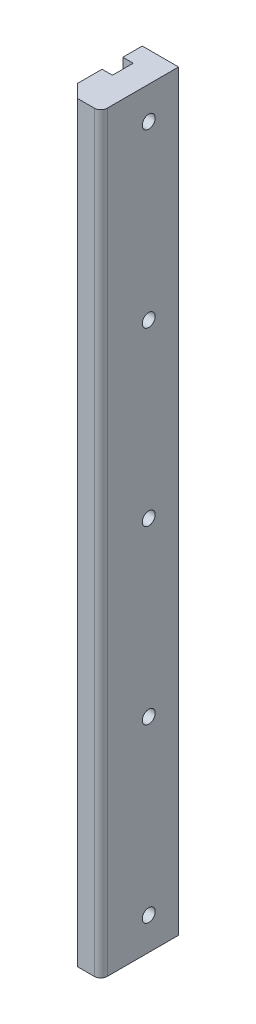
ISO-10303-21;
HEADER;
FILE_DESCRIPTION(('STEP AP214'),'2;1');
FILE_NAME('part.step','',(''),(''),'','','');
FILE_SCHEMA(('AUTOMOTIVE_DESIGN { 1 0 10303 214 1 1 1 1 }'));
ENDSEC;
DATA;
#1=APPLICATION_CONTEXT('core data for automotive mechanical design processes');
#2=APPLICATION_PROTOCOL_DEFINITION('international standard','automotive_design',2000,#1);
#3=PRODUCT_CONTEXT('',#1,'mechanical');
#4=PRODUCT('Part','Part','',(#3));
#5=PRODUCT_RELATED_PRODUCT_CATEGORY('part','',(#4));
#6=PRODUCT_DEFINITION_FORMATION('','',#4);
#7=PRODUCT_DEFINITION_CONTEXT('part definition',#1,'design');
#8=PRODUCT_DEFINITION('design','',#6,#7);
#9=PRODUCT_DEFINITION_SHAPE('','',#8);
#10=(LENGTH_UNIT() NAMED_UNIT(*) SI_UNIT(.MILLI.,.METRE.));
#11=(NAMED_UNIT(*) PLANE_ANGLE_UNIT() SI_UNIT($,.RADIAN.));
#12=(NAMED_UNIT(*) SI_UNIT($,.STERADIAN.) SOLID_ANGLE_UNIT());
#13=UNCERTAINTY_MEASURE_WITH_UNIT(LENGTH_MEASURE(1.E-05),#10,'distance_accuracy_value','');
#14=(GEOMETRIC_REPRESENTATION_CONTEXT(3) GLOBAL_UNCERTAINTY_ASSIGNED_CONTEXT((#13)) GLOBAL_UNIT_ASSIGNED_CONTEXT((#10,
#11,#12)) REPRESENTATION_CONTEXT('',''));
#15=CARTESIAN_POINT('',(0.,0.,0.));
#16=DIRECTION('',(0.,0.,1.));
#17=DIRECTION('',(1.,0.,0.));
#18=AXIS2_PLACEMENT_3D('',#15,#16,#17);
#19=CARTESIAN_POINT('',(0.,580.,0.));
#20=DIRECTION('',(0.,0.,1.));
#21=DIRECTION('',(1.,0.,0.));
#22=AXIS2_PLACEMENT_3D('',#19,#20,#21);
#23=PLANE('',#22);
#24=DIRECTION('',(-1.,0.,0.));
#25=VECTOR('',#24,1.);
#26=CARTESIAN_POINT('',(0.,0.,0.));
#27=LINE('',#26,#25);
#28=CARTESIAN_POINT('',(-5.,0.,0.));
#29=VERTEX_POINT('',#28);
#30=CARTESIAN_POINT('',(-18.,0.,0.));
#31=VERTEX_POINT('',#30);
#32=EDGE_CURVE('E147',#29,#31,#27,.T.);
#33=ORIENTED_EDGE('',*,*,#32,.F.);
#34=DIRECTION('',(0.,-1.,0.));
#35=VECTOR('',#34,1.);
#36=CARTESIAN_POINT('',(-5.,580.,0.));
#37=LINE('',#36,#35);
#38=CARTESIAN_POINT('',(-5.,580.,0.));
#39=VERTEX_POINT('',#38);
#40=EDGE_CURVE('E45',#29,#39,#37,.F.);
#41=ORIENTED_EDGE('',*,*,#40,.T.);
#42=DIRECTION('',(-1.,0.,0.));
#43=VECTOR('',#42,1.);
#44=CARTESIAN_POINT('',(0.,580.,0.));
#45=LINE('',#44,#43);
#46=CARTESIAN_POINT('',(-18.,580.,0.));
#47=VERTEX_POINT('',#46);
#48=EDGE_CURVE('E110',#39,#47,#45,.T.);
#49=ORIENTED_EDGE('',*,*,#48,.T.);
#50=DIRECTION('',(0.,-1.,0.));
#51=VECTOR('',#50,1.);
#52=CARTESIAN_POINT('',(-18.,580.,0.));
#53=LINE('',#52,#51);
#54=EDGE_CURVE('E112',#47,#31,#53,.T.);
#55=ORIENTED_EDGE('',*,*,#54,.T.);
#56=EDGE_LOOP('',(#33,#41,#49,#55));
#57=FACE_BOUND('',#56,.T.);
#58=ADVANCED_FACE('F37',(#57),#23,.T.);
#59=CARTESIAN_POINT('',(0.,580.,0.));
#60=DIRECTION('',(-1.,0.,0.));
#61=DIRECTION('',(0.,0.,1.));
#62=AXIS2_PLACEMENT_3D('',#59,#60,#61);
#63=PLANE('',#62);
#64=CARTESIAN_POINT('',(0.,555.,-37.));
#65=DIRECTION('',(1.,0.,0.));
#66=DIRECTION('',(0.,0.,-1.));
#67=AXIS2_PLACEMENT_3D('',#64,#65,#66);
#68=CIRCLE('',#67,4.99999999999998);
#69=CARTESIAN_POINT('',(0.,555.,-42.));
#70=VERTEX_POINT('',#69);
#71=EDGE_CURVE('E200',#70,#70,#68,.T.);
#72=ORIENTED_EDGE('',*,*,#71,.F.);
#73=EDGE_LOOP('',(#72));
#74=FACE_BOUND('',#73,.T.);
#75=CARTESIAN_POINT('',(0.,422.5,-37.));
#76=DIRECTION('',(1.,0.,0.));
#77=DIRECTION('',(0.,0.,-1.));
#78=AXIS2_PLACEMENT_3D('',#75,#76,#77);
#79=CIRCLE('',#78,5.);
#80=CARTESIAN_POINT('',(0.,422.5,-42.));
#81=VERTEX_POINT('',#80);
#82=EDGE_CURVE('E196',#81,#81,#79,.T.);
#83=ORIENTED_EDGE('',*,*,#82,.F.);
#84=EDGE_LOOP('',(#83));
#85=FACE_BOUND('',#84,.T.);
#86=CARTESIAN_POINT('',(0.,290.,-37.));
#87=DIRECTION('',(1.,0.,0.));
#88=DIRECTION('',(0.,0.,-1.));
#89=AXIS2_PLACEMENT_3D('',#86,#87,#88);
#90=CIRCLE('',#89,5.00000000000002);
#91=CARTESIAN_POINT('',(0.,290.,-42.));
#92=VERTEX_POINT('',#91);
#93=EDGE_CURVE('E192',#92,#92,#90,.T.);
#94=ORIENTED_EDGE('',*,*,#93,.F.);
#95=EDGE_LOOP('',(#94));
#96=FACE_BOUND('',#95,.T.);
#97=CARTESIAN_POINT('',(0.,157.5,-37.));
#98=DIRECTION('',(-1.,0.,0.));
#99=DIRECTION('',(0.,0.,1.));
#100=AXIS2_PLACEMENT_3D('',#97,#98,#99);
#101=CIRCLE('',#100,5.00000000000001);
#102=CARTESIAN_POINT('',(0.,157.5,-32.));
#103=VERTEX_POINT('',#102);
#104=EDGE_CURVE('E301',#103,#103,#101,.T.);
#105=ORIENTED_EDGE('',*,*,#104,.T.);
#106=EDGE_LOOP('',(#105));
#107=FACE_BOUND('',#106,.T.);
#108=CARTESIAN_POINT('',(0.,25.,-37.));
#109=DIRECTION('',(1.,0.,0.));
#110=DIRECTION('',(0.,0.,-1.));
#111=AXIS2_PLACEMENT_3D('',#108,#109,#110);
#112=CIRCLE('',#111,5.);
#113=CARTESIAN_POINT('',(0.,25.,-42.));
#114=VERTEX_POINT('',#113);
#115=EDGE_CURVE('E187',#114,#114,#112,.T.);
#116=ORIENTED_EDGE('',*,*,#115,.F.);
#117=EDGE_LOOP('',(#116));
#118=FACE_BOUND('',#117,.T.);
#119=DIRECTION('',(0.,0.,-1.));
#120=VECTOR('',#119,1.);
#121=CARTESIAN_POINT('',(0.,580.,0.));
#122=LINE('',#121,#120);
#123=CARTESIAN_POINT('',(0.,580.,-5.));
#124=VERTEX_POINT('',#123);
#125=CARTESIAN_POINT('',(0.,580.,-60.));
#126=VERTEX_POINT('',#125);
#127=EDGE_CURVE('E126',#124,#126,#122,.T.);
#128=ORIENTED_EDGE('',*,*,#127,.F.);
#129=DIRECTION('',(0.,-1.,0.));
#130=VECTOR('',#129,1.);
#131=CARTESIAN_POINT('',(0.,0.,-5.));
#132=LINE('',#131,#130);
#133=CARTESIAN_POINT('',(0.,0.,-5.));
#134=VERTEX_POINT('',#133);
#135=EDGE_CURVE('E168',#124,#134,#132,.T.);
#136=ORIENTED_EDGE('',*,*,#135,.T.);
#137=DIRECTION('',(0.,0.,-1.));
#138=VECTOR('',#137,1.);
#139=CARTESIAN_POINT('',(0.,0.,0.));
#140=LINE('',#139,#138);
#141=CARTESIAN_POINT('',(0.,0.,-60.));
#142=VERTEX_POINT('',#141);
#143=EDGE_CURVE('E118',#134,#142,#140,.T.);
#144=ORIENTED_EDGE('',*,*,#143,.T.);
#145=DIRECTION('',(0.,-1.,0.));
#146=VECTOR('',#145,1.);
#147=CARTESIAN_POINT('',(0.,580.,-60.));
#148=LINE('',#147,#146);
#149=EDGE_CURVE('E165',#126,#142,#148,.T.);
#150=ORIENTED_EDGE('',*,*,#149,.F.);
#151=EDGE_LOOP('',(#128,#136,#144,#150));
#152=FACE_BOUND('',#151,.T.);
#153=ADVANCED_FACE('F206',(#74,#85,#96,#107,#118,#152),#63,.F.);
#154=CARTESIAN_POINT('',(0.,580.,-60.));
#155=DIRECTION('',(0.,0.,1.));
#156=DIRECTION('',(1.,0.,0.));
#157=AXIS2_PLACEMENT_3D('',#154,#155,#156);
#158=PLANE('',#157);
#159=DIRECTION('',(-1.,0.,0.));
#160=VECTOR('',#159,1.);
#161=CARTESIAN_POINT('',(0.,0.,-60.));
#162=LINE('',#161,#160);
#163=CARTESIAN_POINT('',(-28.,0.,-60.));
#164=VERTEX_POINT('',#163);
#165=EDGE_CURVE('E162',#142,#164,#162,.T.);
#166=ORIENTED_EDGE('',*,*,#165,.T.);
#167=DIRECTION('',(0.,-1.,0.));
#168=VECTOR('',#167,1.);
#169=CARTESIAN_POINT('',(-28.,580.,-60.));
#170=LINE('',#169,#168);
#171=CARTESIAN_POINT('',(-28.,580.,-60.));
#172=VERTEX_POINT('',#171);
#173=EDGE_CURVE('E169',#172,#164,#170,.T.);
#174=ORIENTED_EDGE('',*,*,#173,.F.);
#175=DIRECTION('',(-1.,0.,0.));
#176=VECTOR('',#175,1.);
#177=CARTESIAN_POINT('',(0.,580.,-60.));
#178=LINE('',#177,#176);
#179=EDGE_CURVE('E144',#126,#172,#178,.T.);
#180=ORIENTED_EDGE('',*,*,#179,.F.);
#181=ORIENTED_EDGE('',*,*,#149,.T.);
#182=EDGE_LOOP('',(#166,#174,#180,#181));
#183=FACE_BOUND('',#182,.T.);
#184=ADVANCED_FACE('F215',(#183),#158,.F.);
#185=CARTESIAN_POINT('',(-28.,580.,-60.));
#186=DIRECTION('',(1.,0.,0.));
#187=DIRECTION('',(0.,0.,-1.));
#188=AXIS2_PLACEMENT_3D('',#185,#186,#187);
#189=PLANE('',#188);
#190=DIRECTION('',(0.,0.,1.));
#191=VECTOR('',#190,1.);
#192=CARTESIAN_POINT('',(-28.,0.,-60.));
#193=LINE('',#192,#191);
#194=CARTESIAN_POINT('',(-28.,0.,-45.));
#195=VERTEX_POINT('',#194);
#196=EDGE_CURVE('E160',#164,#195,#193,.T.);
#197=ORIENTED_EDGE('',*,*,#196,.T.);
#198=DIRECTION('',(0.,-1.,0.));
#199=VECTOR('',#198,1.);
#200=CARTESIAN_POINT('',(-28.,580.,-45.));
#201=LINE('',#200,#199);
#202=CARTESIAN_POINT('',(-28.,580.,-45.));
#203=VERTEX_POINT('',#202);
#204=EDGE_CURVE('E172',#203,#195,#201,.T.);
#205=ORIENTED_EDGE('',*,*,#204,.F.);
#206=DIRECTION('',(0.,0.,1.));
#207=VECTOR('',#206,1.);
#208=CARTESIAN_POINT('',(-28.,580.,-60.));
#209=LINE('',#208,#207);
#210=EDGE_CURVE('E142',#172,#203,#209,.T.);
#211=ORIENTED_EDGE('',*,*,#210,.F.);
#212=ORIENTED_EDGE('',*,*,#173,.T.);
#213=EDGE_LOOP('',(#197,#205,#211,#212));
#214=FACE_BOUND('',#213,.T.);
#215=ADVANCED_FACE('F219',(#214),#189,.F.);
#216=CARTESIAN_POINT('',(-28.,580.,-45.));
#217=DIRECTION('',(0.,0.,-1.));
#218=DIRECTION('',(-1.,0.,0.));
#219=AXIS2_PLACEMENT_3D('',#216,#217,#218);
#220=PLANE('',#219);
#221=DIRECTION('',(1.,0.,0.));
#222=VECTOR('',#221,1.);
#223=CARTESIAN_POINT('',(-28.,0.,-45.));
#224=LINE('',#223,#222);
#225=CARTESIAN_POINT('',(-20.,0.,-45.));
#226=VERTEX_POINT('',#225);
#227=EDGE_CURVE('E158',#195,#226,#224,.T.);
#228=ORIENTED_EDGE('',*,*,#227,.T.);
#229=DIRECTION('',(0.,-1.,0.));
#230=VECTOR('',#229,1.);
#231=CARTESIAN_POINT('',(-20.,580.,-45.));
#232=LINE('',#231,#230);
#233=CARTESIAN_POINT('',(-20.,580.,-45.));
#234=VERTEX_POINT('',#233);
#235=EDGE_CURVE('E175',#234,#226,#232,.T.);
#236=ORIENTED_EDGE('',*,*,#235,.F.);
#237=DIRECTION('',(1.,0.,0.));
#238=VECTOR('',#237,1.);
#239=CARTESIAN_POINT('',(-28.,580.,-45.));
#240=LINE('',#239,#238);
#241=EDGE_CURVE('E140',#203,#234,#240,.T.);
#242=ORIENTED_EDGE('',*,*,#241,.F.);
#243=ORIENTED_EDGE('',*,*,#204,.T.);
#244=EDGE_LOOP('',(#228,#236,#242,#243));
#245=FACE_BOUND('',#244,.T.);
#246=ADVANCED_FACE('F251',(#245),#220,.F.);
#247=CARTESIAN_POINT('',(-20.,580.,-45.));
#248=DIRECTION('',(1.,0.,0.));
#249=DIRECTION('',(0.,0.,-1.));
#250=AXIS2_PLACEMENT_3D('',#247,#248,#249);
#251=PLANE('',#250);
#252=CARTESIAN_POINT('',(-20.,555.,-37.));
#253=DIRECTION('',(1.,0.,0.));
#254=DIRECTION('',(0.,0.,-1.));
#255=AXIS2_PLACEMENT_3D('',#252,#253,#254);
#256=CIRCLE('',#255,4.99999999999998);
#257=CARTESIAN_POINT('',(-20.,555.,-42.));
#258=VERTEX_POINT('',#257);
#259=EDGE_CURVE('E197',#258,#258,#256,.T.);
#260=ORIENTED_EDGE('',*,*,#259,.T.);
#261=EDGE_LOOP('',(#260));
#262=FACE_BOUND('',#261,.T.);
#263=CARTESIAN_POINT('',(-20.,422.5,-37.));
#264=DIRECTION('',(1.,0.,0.));
#265=DIRECTION('',(0.,0.,-1.));
#266=AXIS2_PLACEMENT_3D('',#263,#264,#265);
#267=CIRCLE('',#266,5.);
#268=CARTESIAN_POINT('',(-20.,422.5,-42.));
#269=VERTEX_POINT('',#268);
#270=EDGE_CURVE('E193',#269,#269,#267,.T.);
#271=ORIENTED_EDGE('',*,*,#270,.T.);
#272=EDGE_LOOP('',(#271));
#273=FACE_BOUND('',#272,.T.);
#274=CARTESIAN_POINT('',(-20.,290.,-37.));
#275=DIRECTION('',(1.,0.,0.));
#276=DIRECTION('',(0.,0.,-1.));
#277=AXIS2_PLACEMENT_3D('',#274,#275,#276);
#278=CIRCLE('',#277,5.00000000000002);
#279=CARTESIAN_POINT('',(-20.,290.,-42.));
#280=VERTEX_POINT('',#279);
#281=EDGE_CURVE('E188',#280,#280,#278,.T.);
#282=ORIENTED_EDGE('',*,*,#281,.T.);
#283=EDGE_LOOP('',(#282));
#284=FACE_BOUND('',#283,.T.);
#285=CARTESIAN_POINT('',(-20.,157.5,-37.));
#286=DIRECTION('',(-1.,0.,0.));
#287=DIRECTION('',(0.,0.,1.));
#288=AXIS2_PLACEMENT_3D('',#285,#286,#287);
#289=CIRCLE('',#288,5.00000000000001);
#290=CARTESIAN_POINT('',(-20.,157.5,-32.));
#291=VERTEX_POINT('',#290);
#292=EDGE_CURVE('E191',#291,#291,#289,.T.);
#293=ORIENTED_EDGE('',*,*,#292,.F.);
#294=EDGE_LOOP('',(#293));
#295=FACE_BOUND('',#294,.T.);
#296=CARTESIAN_POINT('',(-20.,25.,-37.));
#297=DIRECTION('',(1.,0.,0.));
#298=DIRECTION('',(0.,0.,-1.));
#299=AXIS2_PLACEMENT_3D('',#296,#297,#298);
#300=CIRCLE('',#299,5.);
#301=CARTESIAN_POINT('',(-20.,25.,-42.));
#302=VERTEX_POINT('',#301);
#303=EDGE_CURVE('E149',#302,#302,#300,.T.);
#304=ORIENTED_EDGE('',*,*,#303,.T.);
#305=EDGE_LOOP('',(#304));
#306=FACE_BOUND('',#305,.T.);
#307=DIRECTION('',(0.,0.,1.));
#308=VECTOR('',#307,1.);
#309=CARTESIAN_POINT('',(-20.,0.,-45.));
#310=LINE('',#309,#308);
#311=CARTESIAN_POINT('',(-20.,0.,-29.));
#312=VERTEX_POINT('',#311);
#313=EDGE_CURVE('E156',#226,#312,#310,.T.);
#314=ORIENTED_EDGE('',*,*,#313,.T.);
#315=DIRECTION('',(0.,-1.,0.));
#316=VECTOR('',#315,1.);
#317=CARTESIAN_POINT('',(-20.,580.,-29.));
#318=LINE('',#317,#316);
#319=CARTESIAN_POINT('',(-20.,580.,-29.));
#320=VERTEX_POINT('',#319);
#321=EDGE_CURVE('E178',#320,#312,#318,.T.);
#322=ORIENTED_EDGE('',*,*,#321,.F.);
#323=DIRECTION('',(0.,0.,1.));
#324=VECTOR('',#323,1.);
#325=CARTESIAN_POINT('',(-20.,580.,-45.));
#326=LINE('',#325,#324);
#327=EDGE_CURVE('E138',#234,#320,#326,.T.);
#328=ORIENTED_EDGE('',*,*,#327,.F.);
#329=ORIENTED_EDGE('',*,*,#235,.T.);
#330=EDGE_LOOP('',(#314,#322,#328,#329));
#331=FACE_BOUND('',#330,.T.);
#332=ADVANCED_FACE('F247',(#262,#273,#284,#295,#306,#331),#251,.F.);
#333=CARTESIAN_POINT('',(-20.,580.,-29.));
#334=DIRECTION('',(0.,0.,1.));
#335=DIRECTION('',(1.,0.,0.));
#336=AXIS2_PLACEMENT_3D('',#333,#334,#335);
#337=PLANE('',#336);
#338=DIRECTION('',(-1.,0.,0.));
#339=VECTOR('',#338,1.);
#340=CARTESIAN_POINT('',(-20.,0.,-29.));
#341=LINE('',#340,#339);
#342=CARTESIAN_POINT('',(-28.,0.,-29.));
#343=VERTEX_POINT('',#342);
#344=EDGE_CURVE('E154',#312,#343,#341,.T.);
#345=ORIENTED_EDGE('',*,*,#344,.T.);
#346=DIRECTION('',(0.,-1.,0.));
#347=VECTOR('',#346,1.);
#348=CARTESIAN_POINT('',(-28.,580.,-29.));
#349=LINE('',#348,#347);
#350=CARTESIAN_POINT('',(-28.,580.,-29.));
#351=VERTEX_POINT('',#350);
#352=EDGE_CURVE('E181',#351,#343,#349,.T.);
#353=ORIENTED_EDGE('',*,*,#352,.F.);
#354=DIRECTION('',(-1.,0.,0.));
#355=VECTOR('',#354,1.);
#356=CARTESIAN_POINT('',(-20.,580.,-29.));
#357=LINE('',#356,#355);
#358=EDGE_CURVE('E133',#320,#351,#357,.T.);
#359=ORIENTED_EDGE('',*,*,#358,.F.);
#360=ORIENTED_EDGE('',*,*,#321,.T.);
#361=EDGE_LOOP('',(#345,#353,#359,#360));
#362=FACE_BOUND('',#361,.T.);
#363=ADVANCED_FACE('F243',(#362),#337,.F.);
#364=CARTESIAN_POINT('',(-28.,580.,-29.));
#365=DIRECTION('',(1.,0.,0.));
#366=DIRECTION('',(0.,0.,-1.));
#367=AXIS2_PLACEMENT_3D('',#364,#365,#366);
#368=PLANE('',#367);
#369=DIRECTION('',(0.,0.,1.));
#370=VECTOR('',#369,1.);
#371=CARTESIAN_POINT('',(-28.,0.,-29.));
#372=LINE('',#371,#370);
#373=CARTESIAN_POINT('',(-28.,0.,-10.));
#374=VERTEX_POINT('',#373);
#375=EDGE_CURVE('E151',#343,#374,#372,.T.);
#376=ORIENTED_EDGE('',*,*,#375,.T.);
#377=DIRECTION('',(0.,-1.,0.));
#378=VECTOR('',#377,1.);
#379=CARTESIAN_POINT('',(-28.,580.,-10.));
#380=LINE('',#379,#378);
#381=CARTESIAN_POINT('',(-28.,580.,-10.));
#382=VERTEX_POINT('',#381);
#383=EDGE_CURVE('E125',#382,#374,#380,.T.);
#384=ORIENTED_EDGE('',*,*,#383,.F.);
#385=DIRECTION('',(0.,0.,1.));
#386=VECTOR('',#385,1.);
#387=CARTESIAN_POINT('',(-28.,580.,-29.));
#388=LINE('',#387,#386);
#389=EDGE_CURVE('E130',#351,#382,#388,.T.);
#390=ORIENTED_EDGE('',*,*,#389,.F.);
#391=ORIENTED_EDGE('',*,*,#352,.T.);
#392=EDGE_LOOP('',(#376,#384,#390,#391));
#393=FACE_BOUND('',#392,.T.);
#394=ADVANCED_FACE('F240',(#393),#368,.F.);
#395=CARTESIAN_POINT('',(-18.,580.,0.));
#396=DIRECTION('',(-0.707106781186547,0.,0.707106781186548));
#397=DIRECTION('',(0.707106781186548,0.,0.707106781186547));
#398=AXIS2_PLACEMENT_3D('',#395,#396,#397);
#399=PLANE('',#398);
#400=DIRECTION('',(-0.707106781186548,0.,-0.707106781186547));
#401=VECTOR('',#400,1.);
#402=CARTESIAN_POINT('',(-18.,0.,0.));
#403=LINE('',#402,#401);
#404=EDGE_CURVE('E124',#31,#374,#403,.T.);
#405=ORIENTED_EDGE('',*,*,#404,.F.);
#406=ORIENTED_EDGE('',*,*,#54,.F.);
#407=DIRECTION('',(-0.707106781186548,0.,-0.707106781186547));
#408=VECTOR('',#407,1.);
#409=CARTESIAN_POINT('',(-18.,580.,0.));
#410=LINE('',#409,#408);
#411=EDGE_CURVE('E117',#47,#382,#410,.T.);
#412=ORIENTED_EDGE('',*,*,#411,.T.);
#413=ORIENTED_EDGE('',*,*,#383,.T.);
#414=EDGE_LOOP('',(#405,#406,#412,#413));
#415=FACE_BOUND('',#414,.T.);
#416=ADVANCED_FACE('F122',(#415),#399,.T.);
#417=CARTESIAN_POINT('',(0.,580.,0.));
#418=DIRECTION('',(0.,1.,0.));
#419=DIRECTION('',(0.,0.,1.));
#420=AXIS2_PLACEMENT_3D('',#417,#418,#419);
#421=PLANE('',#420);
#422=ORIENTED_EDGE('',*,*,#48,.F.);
#423=CARTESIAN_POINT('',(-5.,580.,-5.));
#424=DIRECTION('',(0.,1.,0.));
#425=DIRECTION('',(0.,0.,1.));
#426=AXIS2_PLACEMENT_3D('',#423,#424,#425);
#427=CIRCLE('',#426,5.);
#428=EDGE_CURVE('E11',#39,#124,#427,.T.);
#429=ORIENTED_EDGE('',*,*,#428,.T.);
#430=ORIENTED_EDGE('',*,*,#127,.T.);
#431=ORIENTED_EDGE('',*,*,#179,.T.);
#432=ORIENTED_EDGE('',*,*,#210,.T.);
#433=ORIENTED_EDGE('',*,*,#241,.T.);
#434=ORIENTED_EDGE('',*,*,#327,.T.);
#435=ORIENTED_EDGE('',*,*,#358,.T.);
#436=ORIENTED_EDGE('',*,*,#389,.T.);
#437=ORIENTED_EDGE('',*,*,#411,.F.);
#438=EDGE_LOOP('',(#422,#429,#430,#431,#432,#433,#434,#435,#436,#437));
#439=FACE_BOUND('',#438,.T.);
#440=ADVANCED_FACE('F128',(#439),#421,.T.);
#441=CARTESIAN_POINT('',(0.,0.,0.));
#442=DIRECTION('',(0.,1.,0.));
#443=DIRECTION('',(0.,0.,1.));
#444=AXIS2_PLACEMENT_3D('',#441,#442,#443);
#445=PLANE('',#444);
#446=ORIENTED_EDGE('',*,*,#143,.F.);
#447=CARTESIAN_POINT('',(-5.,0.,-5.));
#448=DIRECTION('',(0.,1.,0.));
#449=DIRECTION('',(0.,0.,1.));
#450=AXIS2_PLACEMENT_3D('',#447,#448,#449);
#451=CIRCLE('',#450,5.);
#452=EDGE_CURVE('E59',#134,#29,#451,.F.);
#453=ORIENTED_EDGE('',*,*,#452,.T.);
#454=ORIENTED_EDGE('',*,*,#32,.T.);
#455=ORIENTED_EDGE('',*,*,#404,.T.);
#456=ORIENTED_EDGE('',*,*,#375,.F.);
#457=ORIENTED_EDGE('',*,*,#344,.F.);
#458=ORIENTED_EDGE('',*,*,#313,.F.);
#459=ORIENTED_EDGE('',*,*,#227,.F.);
#460=ORIENTED_EDGE('',*,*,#196,.F.);
#461=ORIENTED_EDGE('',*,*,#165,.F.);
#462=EDGE_LOOP('',(#446,#453,#454,#455,#456,#457,#458,#459,#460,#461));
#463=FACE_BOUND('',#462,.T.);
#464=ADVANCED_FACE('F210',(#463),#445,.F.);
#465=CARTESIAN_POINT('',(-580.,25.,-37.));
#466=DIRECTION('',(1.,0.,0.));
#467=DIRECTION('',(0.,0.,-1.));
#468=AXIS2_PLACEMENT_3D('',#465,#466,#467);
#469=CYLINDRICAL_SURFACE('',#468,5.);
#470=ORIENTED_EDGE('',*,*,#115,.T.);
#471=EDGE_LOOP('',(#470));
#472=FACE_BOUND('',#471,.T.);
#473=ORIENTED_EDGE('',*,*,#303,.F.);
#474=EDGE_LOOP('',(#473));
#475=FACE_BOUND('',#474,.T.);
#476=ADVANCED_FACE('F262',(#472,#475),#469,.F.);
#477=CARTESIAN_POINT('',(560.,157.5,-37.0000000000001));
#478=DIRECTION('',(-1.,0.,0.));
#479=DIRECTION('',(0.,0.,1.));
#480=AXIS2_PLACEMENT_3D('',#477,#478,#479);
#481=CYLINDRICAL_SURFACE('',#480,5.00000000000001);
#482=ORIENTED_EDGE('',*,*,#292,.T.);
#483=EDGE_LOOP('',(#482));
#484=FACE_BOUND('',#483,.T.);
#485=ORIENTED_EDGE('',*,*,#104,.F.);
#486=EDGE_LOOP('',(#485));
#487=FACE_BOUND('',#486,.T.);
#488=ADVANCED_FACE('F267',(#484,#487),#481,.F.);
#489=CARTESIAN_POINT('',(-580.,290.,-37.));
#490=DIRECTION('',(1.,0.,0.));
#491=DIRECTION('',(0.,0.,-1.));
#492=AXIS2_PLACEMENT_3D('',#489,#490,#491);
#493=CYLINDRICAL_SURFACE('',#492,5.00000000000002);
#494=ORIENTED_EDGE('',*,*,#93,.T.);
#495=EDGE_LOOP('',(#494));
#496=FACE_BOUND('',#495,.T.);
#497=ORIENTED_EDGE('',*,*,#281,.F.);
#498=EDGE_LOOP('',(#497));
#499=FACE_BOUND('',#498,.T.);
#500=ADVANCED_FACE('F271',(#496,#499),#493,.F.);
#501=CARTESIAN_POINT('',(-580.,422.5,-37.));
#502=DIRECTION('',(1.,0.,0.));
#503=DIRECTION('',(0.,0.,-1.));
#504=AXIS2_PLACEMENT_3D('',#501,#502,#503);
#505=CYLINDRICAL_SURFACE('',#504,5.);
#506=ORIENTED_EDGE('',*,*,#82,.T.);
#507=EDGE_LOOP('',(#506));
#508=FACE_BOUND('',#507,.T.);
#509=ORIENTED_EDGE('',*,*,#270,.F.);
#510=EDGE_LOOP('',(#509));
#511=FACE_BOUND('',#510,.T.);
#512=ADVANCED_FACE('F228',(#508,#511),#505,.F.);
#513=CARTESIAN_POINT('',(-580.,555.,-37.));
#514=DIRECTION('',(1.,0.,0.));
#515=DIRECTION('',(0.,0.,-1.));
#516=AXIS2_PLACEMENT_3D('',#513,#514,#515);
#517=CYLINDRICAL_SURFACE('',#516,4.99999999999998);
#518=ORIENTED_EDGE('',*,*,#71,.T.);
#519=EDGE_LOOP('',(#518));
#520=FACE_BOUND('',#519,.T.);
#521=ORIENTED_EDGE('',*,*,#259,.F.);
#522=EDGE_LOOP('',(#521));
#523=FACE_BOUND('',#522,.T.);
#524=ADVANCED_FACE('F224',(#520,#523),#517,.F.);
#525=CARTESIAN_POINT('',(-5.,580.,-5.));
#526=DIRECTION('',(0.,1.,0.));
#527=DIRECTION('',(0.,0.,1.));
#528=AXIS2_PLACEMENT_3D('',#525,#526,#527);
#529=CYLINDRICAL_SURFACE('',#528,5.);
#530=ORIENTED_EDGE('',*,*,#428,.F.);
#531=ORIENTED_EDGE('',*,*,#40,.F.);
#532=ORIENTED_EDGE('',*,*,#452,.F.);
#533=ORIENTED_EDGE('',*,*,#135,.F.);
#534=EDGE_LOOP('',(#530,#531,#532,#533));
#535=FACE_BOUND('',#534,.T.);
#536=ADVANCED_FACE('F39',(#535),#529,.T.);
#537=CLOSED_SHELL('',(#58,#153,#184,#215,#246,#332,#363,#394,#416,#440,#464,#476,#488,#500,#512,
#524,#536));
#538=MANIFOLD_SOLID_BREP('B2',#537);
#539=ADVANCED_BREP_SHAPE_REPRESENTATION('',(#18,#538),#14);
#540=SHAPE_DEFINITION_REPRESENTATION(#9,#539);
ENDSEC;
END-ISO-10303-21;
